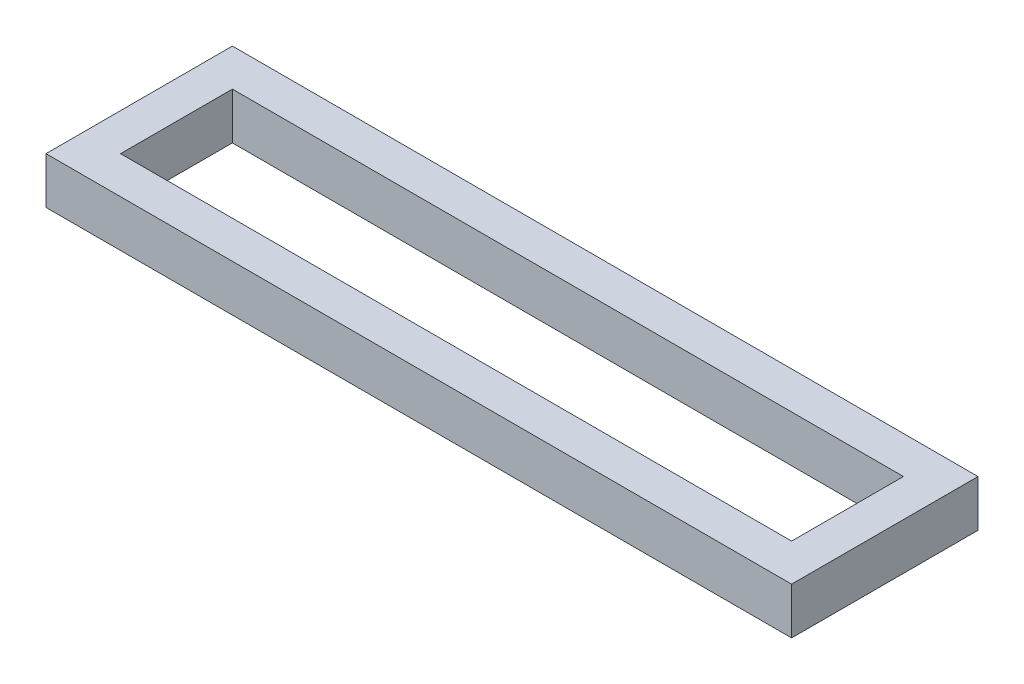
ISO-10303-21;
HEADER;
FILE_DESCRIPTION(('STEP AP214'),'2;1');
FILE_NAME('part.step','',(''),(''),'','','');
FILE_SCHEMA(('AUTOMOTIVE_DESIGN { 1 0 10303 214 1 1 1 1 }'));
ENDSEC;
DATA;
#1=APPLICATION_CONTEXT('core data for automotive mechanical design processes');
#2=APPLICATION_PROTOCOL_DEFINITION('international standard','automotive_design',2000,#1);
#3=PRODUCT_CONTEXT('',#1,'mechanical');
#4=PRODUCT('Part','Part','',(#3));
#5=PRODUCT_RELATED_PRODUCT_CATEGORY('part','',(#4));
#6=PRODUCT_DEFINITION_FORMATION('','',#4);
#7=PRODUCT_DEFINITION_CONTEXT('part definition',#1,'design');
#8=PRODUCT_DEFINITION('design','',#6,#7);
#9=PRODUCT_DEFINITION_SHAPE('','',#8);
#10=(LENGTH_UNIT() NAMED_UNIT(*) SI_UNIT(.MILLI.,.METRE.));
#11=(NAMED_UNIT(*) PLANE_ANGLE_UNIT() SI_UNIT($,.RADIAN.));
#12=(NAMED_UNIT(*) SI_UNIT($,.STERADIAN.) SOLID_ANGLE_UNIT());
#13=UNCERTAINTY_MEASURE_WITH_UNIT(LENGTH_MEASURE(1.E-05),#10,'distance_accuracy_value','');
#14=(GEOMETRIC_REPRESENTATION_CONTEXT(3) GLOBAL_UNCERTAINTY_ASSIGNED_CONTEXT((#13)) GLOBAL_UNIT_ASSIGNED_CONTEXT((#10,
#11,#12)) REPRESENTATION_CONTEXT('',''));
#15=CARTESIAN_POINT('',(0.,0.,0.));
#16=DIRECTION('',(0.,0.,1.));
#17=DIRECTION('',(1.,0.,0.));
#18=AXIS2_PLACEMENT_3D('',#15,#16,#17);
#19=CARTESIAN_POINT('',(0.,5.,0.));
#20=DIRECTION('',(0.,-1.,0.));
#21=DIRECTION('',(0.,0.,-1.));
#22=AXIS2_PLACEMENT_3D('',#19,#20,#21);
#23=PLANE('',#22);
#24=DIRECTION('',(0.,0.,1.));
#25=VECTOR('',#24,1.);
#26=CARTESIAN_POINT('',(0.,5.,0.));
#27=LINE('',#26,#25);
#28=CARTESIAN_POINT('',(0.,5.,-20.));
#29=VERTEX_POINT('',#28);
#30=CARTESIAN_POINT('',(0.,5.,0.));
#31=VERTEX_POINT('',#30);
#32=EDGE_CURVE('E159',#29,#31,#27,.T.);
#33=ORIENTED_EDGE('',*,*,#32,.T.);
#34=DIRECTION('',(1.,0.,0.));
#35=VECTOR('',#34,1.);
#36=CARTESIAN_POINT('',(0.,5.,0.));
#37=LINE('',#36,#35);
#38=CARTESIAN_POINT('',(80.,5.,0.));
#39=VERTEX_POINT('',#38);
#40=EDGE_CURVE('E163',#31,#39,#37,.T.);
#41=ORIENTED_EDGE('',*,*,#40,.T.);
#42=DIRECTION('',(0.,0.,-1.));
#43=VECTOR('',#42,1.);
#44=CARTESIAN_POINT('',(80.,5.,0.));
#45=LINE('',#44,#43);
#46=CARTESIAN_POINT('',(80.,5.,-20.));
#47=VERTEX_POINT('',#46);
#48=EDGE_CURVE('E167',#39,#47,#45,.T.);
#49=ORIENTED_EDGE('',*,*,#48,.T.);
#50=DIRECTION('',(-1.,0.,0.));
#51=VECTOR('',#50,1.);
#52=CARTESIAN_POINT('',(0.,5.,-20.));
#53=LINE('',#52,#51);
#54=EDGE_CURVE('E170',#47,#29,#53,.T.);
#55=ORIENTED_EDGE('',*,*,#54,.T.);
#56=EDGE_LOOP('',(#33,#41,#49,#55));
#57=FACE_BOUND('',#56,.T.);
#58=DIRECTION('',(1.,0.,0.));
#59=VECTOR('',#58,1.);
#60=CARTESIAN_POINT('',(4.,5.,-4.));
#61=LINE('',#60,#59);
#62=CARTESIAN_POINT('',(4.,5.,-4.));
#63=VERTEX_POINT('',#62);
#64=CARTESIAN_POINT('',(76.,5.,-4.));
#65=VERTEX_POINT('',#64);
#66=EDGE_CURVE('E111',#63,#65,#61,.T.);
#67=ORIENTED_EDGE('',*,*,#66,.F.);
#68=DIRECTION('',(0.,0.,1.));
#69=VECTOR('',#68,1.);
#70=CARTESIAN_POINT('',(4.,5.,-4.));
#71=LINE('',#70,#69);
#72=CARTESIAN_POINT('',(4.,5.,-16.));
#73=VERTEX_POINT('',#72);
#74=EDGE_CURVE('E137',#73,#63,#71,.T.);
#75=ORIENTED_EDGE('',*,*,#74,.F.);
#76=DIRECTION('',(-1.,0.,0.));
#77=VECTOR('',#76,1.);
#78=CARTESIAN_POINT('',(4.,5.,-16.));
#79=LINE('',#78,#77);
#80=CARTESIAN_POINT('',(76.,5.,-16.));
#81=VERTEX_POINT('',#80);
#82=EDGE_CURVE('E133',#81,#73,#79,.T.);
#83=ORIENTED_EDGE('',*,*,#82,.F.);
#84=DIRECTION('',(0.,0.,-1.));
#85=VECTOR('',#84,1.);
#86=CARTESIAN_POINT('',(76.,5.,-4.));
#87=LINE('',#86,#85);
#88=EDGE_CURVE('E120',#65,#81,#87,.T.);
#89=ORIENTED_EDGE('',*,*,#88,.F.);
#90=EDGE_LOOP('',(#67,#75,#83,#89));
#91=FACE_BOUND('',#90,.T.);
#92=ADVANCED_FACE('F45',(#57,#91),#23,.F.);
#93=CARTESIAN_POINT('',(0.,0.,0.));
#94=DIRECTION('',(0.,-1.,0.));
#95=DIRECTION('',(0.,0.,-1.));
#96=AXIS2_PLACEMENT_3D('',#93,#94,#95);
#97=PLANE('',#96);
#98=DIRECTION('',(0.,0.,1.));
#99=VECTOR('',#98,1.);
#100=CARTESIAN_POINT('',(0.,0.,0.));
#101=LINE('',#100,#99);
#102=CARTESIAN_POINT('',(0.,0.,-20.));
#103=VERTEX_POINT('',#102);
#104=CARTESIAN_POINT('',(0.,0.,0.));
#105=VERTEX_POINT('',#104);
#106=EDGE_CURVE('E129',#103,#105,#101,.T.);
#107=ORIENTED_EDGE('',*,*,#106,.F.);
#108=DIRECTION('',(-1.,0.,0.));
#109=VECTOR('',#108,1.);
#110=CARTESIAN_POINT('',(0.,0.,-20.));
#111=LINE('',#110,#109);
#112=CARTESIAN_POINT('',(80.,0.,-20.));
#113=VERTEX_POINT('',#112);
#114=EDGE_CURVE('E164',#113,#103,#111,.T.);
#115=ORIENTED_EDGE('',*,*,#114,.F.);
#116=DIRECTION('',(0.,0.,-1.));
#117=VECTOR('',#116,1.);
#118=CARTESIAN_POINT('',(80.,0.,0.));
#119=LINE('',#118,#117);
#120=CARTESIAN_POINT('',(80.,0.,0.));
#121=VERTEX_POINT('',#120);
#122=EDGE_CURVE('E180',#121,#113,#119,.T.);
#123=ORIENTED_EDGE('',*,*,#122,.F.);
#124=DIRECTION('',(1.,0.,0.));
#125=VECTOR('',#124,1.);
#126=CARTESIAN_POINT('',(0.,0.,0.));
#127=LINE('',#126,#125);
#128=EDGE_CURVE('E177',#105,#121,#127,.T.);
#129=ORIENTED_EDGE('',*,*,#128,.F.);
#130=EDGE_LOOP('',(#107,#115,#123,#129));
#131=FACE_BOUND('',#130,.T.);
#132=DIRECTION('',(0.,0.,1.));
#133=VECTOR('',#132,1.);
#134=CARTESIAN_POINT('',(4.,0.,-4.));
#135=LINE('',#134,#133);
#136=CARTESIAN_POINT('',(4.,0.,-16.));
#137=VERTEX_POINT('',#136);
#138=CARTESIAN_POINT('',(4.,0.,-4.));
#139=VERTEX_POINT('',#138);
#140=EDGE_CURVE('E121',#137,#139,#135,.T.);
#141=ORIENTED_EDGE('',*,*,#140,.T.);
#142=DIRECTION('',(1.,0.,0.));
#143=VECTOR('',#142,1.);
#144=CARTESIAN_POINT('',(4.,0.,-4.));
#145=LINE('',#144,#143);
#146=CARTESIAN_POINT('',(76.,0.,-4.));
#147=VERTEX_POINT('',#146);
#148=EDGE_CURVE('E69',#139,#147,#145,.T.);
#149=ORIENTED_EDGE('',*,*,#148,.T.);
#150=DIRECTION('',(0.,0.,-1.));
#151=VECTOR('',#150,1.);
#152=CARTESIAN_POINT('',(76.,0.,-4.));
#153=LINE('',#152,#151);
#154=CARTESIAN_POINT('',(76.,0.,-16.));
#155=VERTEX_POINT('',#154);
#156=EDGE_CURVE('E127',#147,#155,#153,.T.);
#157=ORIENTED_EDGE('',*,*,#156,.T.);
#158=DIRECTION('',(-1.,0.,0.));
#159=VECTOR('',#158,1.);
#160=CARTESIAN_POINT('',(4.,0.,-16.));
#161=LINE('',#160,#159);
#162=EDGE_CURVE('E146',#155,#137,#161,.T.);
#163=ORIENTED_EDGE('',*,*,#162,.T.);
#164=EDGE_LOOP('',(#141,#149,#157,#163));
#165=FACE_BOUND('',#164,.T.);
#166=ADVANCED_FACE('F203',(#131,#165),#97,.T.);
#167=CARTESIAN_POINT('',(0.,5.,0.));
#168=DIRECTION('',(1.,0.,0.));
#169=DIRECTION('',(0.,0.,-1.));
#170=AXIS2_PLACEMENT_3D('',#167,#168,#169);
#171=PLANE('',#170);
#172=ORIENTED_EDGE('',*,*,#106,.T.);
#173=DIRECTION('',(0.,-1.,0.));
#174=VECTOR('',#173,1.);
#175=CARTESIAN_POINT('',(0.,5.,0.));
#176=LINE('',#175,#174);
#177=EDGE_CURVE('E11',#31,#105,#176,.T.);
#178=ORIENTED_EDGE('',*,*,#177,.F.);
#179=ORIENTED_EDGE('',*,*,#32,.F.);
#180=DIRECTION('',(0.,-1.,0.));
#181=VECTOR('',#180,1.);
#182=CARTESIAN_POINT('',(0.,5.,-20.));
#183=LINE('',#182,#181);
#184=EDGE_CURVE('E173',#29,#103,#183,.T.);
#185=ORIENTED_EDGE('',*,*,#184,.T.);
#186=EDGE_LOOP('',(#172,#178,#179,#185));
#187=FACE_BOUND('',#186,.T.);
#188=ADVANCED_FACE('F47',(#187),#171,.F.);
#189=CARTESIAN_POINT('',(0.,5.,0.));
#190=DIRECTION('',(0.,0.,-1.));
#191=DIRECTION('',(-1.,0.,0.));
#192=AXIS2_PLACEMENT_3D('',#189,#190,#191);
#193=PLANE('',#192);
#194=ORIENTED_EDGE('',*,*,#128,.T.);
#195=DIRECTION('',(0.,-1.,0.));
#196=VECTOR('',#195,1.);
#197=CARTESIAN_POINT('',(80.,5.,0.));
#198=LINE('',#197,#196);
#199=EDGE_CURVE('E54',#39,#121,#198,.T.);
#200=ORIENTED_EDGE('',*,*,#199,.F.);
#201=ORIENTED_EDGE('',*,*,#40,.F.);
#202=ORIENTED_EDGE('',*,*,#177,.T.);
#203=EDGE_LOOP('',(#194,#200,#201,#202));
#204=FACE_BOUND('',#203,.T.);
#205=ADVANCED_FACE('F213',(#204),#193,.F.);
#206=CARTESIAN_POINT('',(80.,5.,0.));
#207=DIRECTION('',(-1.,0.,0.));
#208=DIRECTION('',(0.,0.,1.));
#209=AXIS2_PLACEMENT_3D('',#206,#207,#208);
#210=PLANE('',#209);
#211=ORIENTED_EDGE('',*,*,#122,.T.);
#212=DIRECTION('',(0.,-1.,0.));
#213=VECTOR('',#212,1.);
#214=CARTESIAN_POINT('',(80.,5.,-20.));
#215=LINE('',#214,#213);
#216=EDGE_CURVE('E188',#47,#113,#215,.T.);
#217=ORIENTED_EDGE('',*,*,#216,.F.);
#218=ORIENTED_EDGE('',*,*,#48,.F.);
#219=ORIENTED_EDGE('',*,*,#199,.T.);
#220=EDGE_LOOP('',(#211,#217,#218,#219));
#221=FACE_BOUND('',#220,.T.);
#222=ADVANCED_FACE('F197',(#221),#210,.F.);
#223=CARTESIAN_POINT('',(0.,5.,-20.));
#224=DIRECTION('',(0.,0.,1.));
#225=DIRECTION('',(1.,0.,0.));
#226=AXIS2_PLACEMENT_3D('',#223,#224,#225);
#227=PLANE('',#226);
#228=ORIENTED_EDGE('',*,*,#114,.T.);
#229=ORIENTED_EDGE('',*,*,#184,.F.);
#230=ORIENTED_EDGE('',*,*,#54,.F.);
#231=ORIENTED_EDGE('',*,*,#216,.T.);
#232=EDGE_LOOP('',(#228,#229,#230,#231));
#233=FACE_BOUND('',#232,.T.);
#234=ADVANCED_FACE('F207',(#233),#227,.F.);
#235=CARTESIAN_POINT('',(4.,5.,-4.));
#236=DIRECTION('',(0.,0.,-1.));
#237=DIRECTION('',(-1.,0.,0.));
#238=AXIS2_PLACEMENT_3D('',#235,#236,#237);
#239=PLANE('',#238);
#240=ORIENTED_EDGE('',*,*,#148,.F.);
#241=DIRECTION('',(0.,-1.,0.));
#242=VECTOR('',#241,1.);
#243=CARTESIAN_POINT('',(4.,5.,-4.));
#244=LINE('',#243,#242);
#245=EDGE_CURVE('E115',#63,#139,#244,.T.);
#246=ORIENTED_EDGE('',*,*,#245,.F.);
#247=ORIENTED_EDGE('',*,*,#66,.T.);
#248=DIRECTION('',(0.,-1.,0.));
#249=VECTOR('',#248,1.);
#250=CARTESIAN_POINT('',(76.,5.,-4.));
#251=LINE('',#250,#249);
#252=EDGE_CURVE('E114',#65,#147,#251,.T.);
#253=ORIENTED_EDGE('',*,*,#252,.T.);
#254=EDGE_LOOP('',(#240,#246,#247,#253));
#255=FACE_BOUND('',#254,.T.);
#256=ADVANCED_FACE('F113',(#255),#239,.T.);
#257=CARTESIAN_POINT('',(76.,5.,-4.));
#258=DIRECTION('',(-1.,0.,0.));
#259=DIRECTION('',(0.,0.,1.));
#260=AXIS2_PLACEMENT_3D('',#257,#258,#259);
#261=PLANE('',#260);
#262=ORIENTED_EDGE('',*,*,#156,.F.);
#263=ORIENTED_EDGE('',*,*,#252,.F.);
#264=ORIENTED_EDGE('',*,*,#88,.T.);
#265=DIRECTION('',(0.,-1.,0.));
#266=VECTOR('',#265,1.);
#267=CARTESIAN_POINT('',(76.,5.,-16.));
#268=LINE('',#267,#266);
#269=EDGE_CURVE('E130',#81,#155,#268,.T.);
#270=ORIENTED_EDGE('',*,*,#269,.T.);
#271=EDGE_LOOP('',(#262,#263,#264,#270));
#272=FACE_BOUND('',#271,.T.);
#273=ADVANCED_FACE('F124',(#272),#261,.T.);
#274=CARTESIAN_POINT('',(4.,5.,-16.));
#275=DIRECTION('',(0.,0.,1.));
#276=DIRECTION('',(1.,0.,0.));
#277=AXIS2_PLACEMENT_3D('',#274,#275,#276);
#278=PLANE('',#277);
#279=ORIENTED_EDGE('',*,*,#162,.F.);
#280=ORIENTED_EDGE('',*,*,#269,.F.);
#281=ORIENTED_EDGE('',*,*,#82,.T.);
#282=DIRECTION('',(0.,-1.,0.));
#283=VECTOR('',#282,1.);
#284=CARTESIAN_POINT('',(4.,5.,-16.));
#285=LINE('',#284,#283);
#286=EDGE_CURVE('E61',#73,#137,#285,.T.);
#287=ORIENTED_EDGE('',*,*,#286,.T.);
#288=EDGE_LOOP('',(#279,#280,#281,#287));
#289=FACE_BOUND('',#288,.T.);
#290=ADVANCED_FACE('F236',(#289),#278,.T.);
#291=CARTESIAN_POINT('',(4.,5.,-4.));
#292=DIRECTION('',(1.,0.,0.));
#293=DIRECTION('',(0.,0.,-1.));
#294=AXIS2_PLACEMENT_3D('',#291,#292,#293);
#295=PLANE('',#294);
#296=ORIENTED_EDGE('',*,*,#140,.F.);
#297=ORIENTED_EDGE('',*,*,#286,.F.);
#298=ORIENTED_EDGE('',*,*,#74,.T.);
#299=ORIENTED_EDGE('',*,*,#245,.T.);
#300=EDGE_LOOP('',(#296,#297,#298,#299));
#301=FACE_BOUND('',#300,.T.);
#302=ADVANCED_FACE('F240',(#301),#295,.T.);
#303=CLOSED_SHELL('',(#92,#166,#188,#205,#222,#234,#256,#273,#290,#302));
#304=MANIFOLD_SOLID_BREP('B2',#303);
#305=ADVANCED_BREP_SHAPE_REPRESENTATION('',(#18,#304),#14);
#306=SHAPE_DEFINITION_REPRESENTATION(#9,#305);
ENDSEC;
END-ISO-10303-21;
